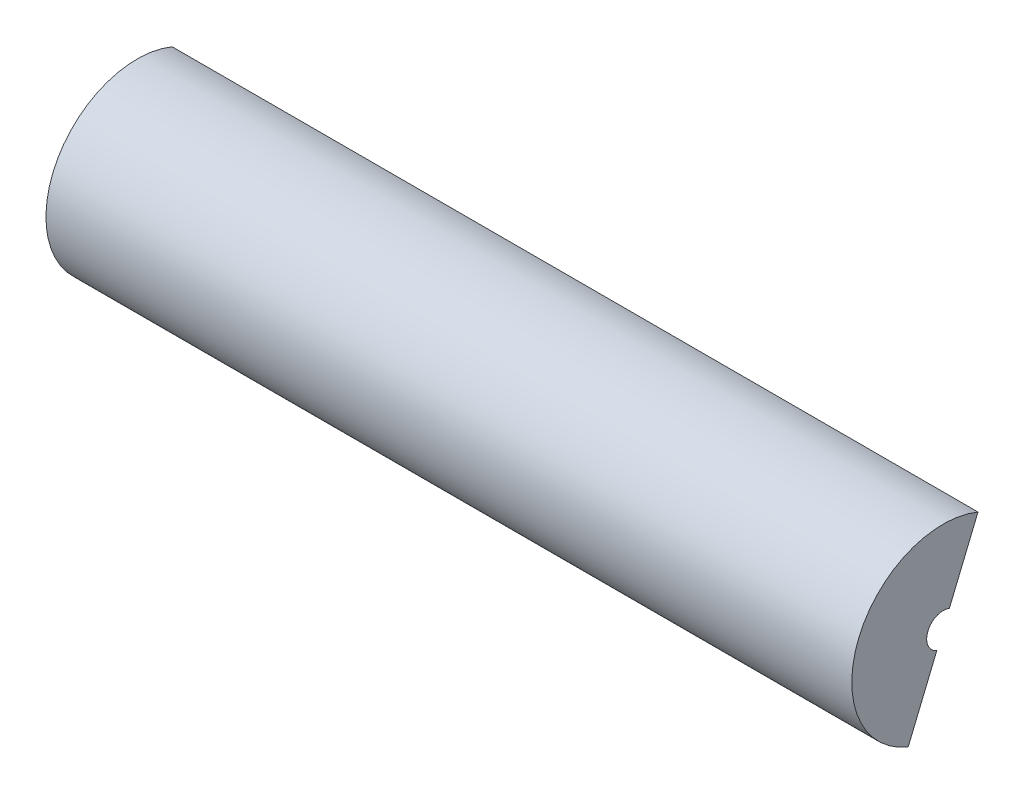
ISO-10303-21;
HEADER;
FILE_DESCRIPTION(('STEP AP214'),'2;1');
FILE_NAME('part.step','',(''),(''),'','','');
FILE_SCHEMA(('AUTOMOTIVE_DESIGN { 1 0 10303 214 1 1 1 1 }'));
ENDSEC;
DATA;
#1=APPLICATION_CONTEXT('core data for automotive mechanical design processes');
#2=APPLICATION_PROTOCOL_DEFINITION('international standard','automotive_design',2000,#1);
#3=PRODUCT_CONTEXT('',#1,'mechanical');
#4=PRODUCT('Part','Part','',(#3));
#5=PRODUCT_RELATED_PRODUCT_CATEGORY('part','',(#4));
#6=PRODUCT_DEFINITION_FORMATION('','',#4);
#7=PRODUCT_DEFINITION_CONTEXT('part definition',#1,'design');
#8=PRODUCT_DEFINITION('design','',#6,#7);
#9=PRODUCT_DEFINITION_SHAPE('','',#8);
#10=(LENGTH_UNIT() NAMED_UNIT(*) SI_UNIT(.MILLI.,.METRE.));
#11=(NAMED_UNIT(*) PLANE_ANGLE_UNIT() SI_UNIT($,.RADIAN.));
#12=(NAMED_UNIT(*) SI_UNIT($,.STERADIAN.) SOLID_ANGLE_UNIT());
#13=UNCERTAINTY_MEASURE_WITH_UNIT(LENGTH_MEASURE(1.E-05),#10,'distance_accuracy_value','');
#14=(GEOMETRIC_REPRESENTATION_CONTEXT(3) GLOBAL_UNCERTAINTY_ASSIGNED_CONTEXT((#13)) GLOBAL_UNIT_ASSIGNED_CONTEXT((#10,
#11,#12)) REPRESENTATION_CONTEXT('',''));
#15=CARTESIAN_POINT('',(0.,0.,0.));
#16=DIRECTION('',(0.,0.,1.));
#17=DIRECTION('',(1.,0.,0.));
#18=AXIS2_PLACEMENT_3D('',#15,#16,#17);
#19=CARTESIAN_POINT('',(0.,12.7,0.));
#20=DIRECTION('',(1.,0.,0.));
#21=DIRECTION('',(0.,0.,-1.));
#22=AXIS2_PLACEMENT_3D('',#19,#20,#21);
#23=PLANE('',#22);
#24=CARTESIAN_POINT('',(0.,0.,0.));
#25=DIRECTION('',(-1.,0.,0.));
#26=DIRECTION('',(0.,0.,1.));
#27=AXIS2_PLACEMENT_3D('',#24,#25,#26);
#28=CIRCLE('',#27,31.);
#29=CARTESIAN_POINT('',(0.,-28.6402655078499,11.8631864033178));
#30=VERTEX_POINT('',#29);
#31=CARTESIAN_POINT('',(0.,28.6402655078499,-11.8631864033178));
#32=VERTEX_POINT('',#31);
#33=EDGE_CURVE('E119',#30,#32,#28,.T.);
#34=ORIENTED_EDGE('',*,*,#33,.T.);
#35=DIRECTION('',(0.,-0.923879532511287,0.382683432365091));
#36=VECTOR('',#35,1.);
#37=CARTESIAN_POINT('',(0.,28.6402655078499,-11.8631864033178));
#38=LINE('',#37,#36);
#39=CARTESIAN_POINT('',(0.,11.7332700628933,-4.86007959103665));
#40=VERTEX_POINT('',#39);
#41=EDGE_CURVE('E101',#32,#40,#38,.T.);
#42=ORIENTED_EDGE('',*,*,#41,.T.);
#43=CARTESIAN_POINT('',(0.,0.,0.));
#44=DIRECTION('',(-1.,0.,0.));
#45=DIRECTION('',(0.,0.,1.));
#46=AXIS2_PLACEMENT_3D('',#43,#44,#45);
#47=CIRCLE('',#46,12.7);
#48=CARTESIAN_POINT('',(0.,-11.7332700628933,4.86007959103665));
#49=VERTEX_POINT('',#48);
#50=EDGE_CURVE('E11',#49,#40,#47,.T.);
#51=ORIENTED_EDGE('',*,*,#50,.F.);
#52=EDGE_CURVE('E113',#49,#30,#38,.T.);
#53=ORIENTED_EDGE('',*,*,#52,.T.);
#54=EDGE_LOOP('',(#34,#42,#51,#53));
#55=FACE_BOUND('',#54,.T.);
#56=ADVANCED_FACE('F39',(#55),#23,.F.);
#57=CARTESIAN_POINT('',(0.,0.,0.));
#58=DIRECTION('',(-1.,0.,0.));
#59=DIRECTION('',(0.,0.,1.));
#60=AXIS2_PLACEMENT_3D('',#57,#58,#59);
#61=CYLINDRICAL_SURFACE('',#60,12.7);
#62=ORIENTED_EDGE('',*,*,#50,.T.);
#63=DIRECTION('',(-1.,0.,0.));
#64=VECTOR('',#63,1.);
#65=CARTESIAN_POINT('',(0.,11.7332700628933,-4.86007959103665));
#66=LINE('',#65,#64);
#67=CARTESIAN_POINT('',(196.85,11.7332700628933,-4.86007959103665));
#68=VERTEX_POINT('',#67);
#69=EDGE_CURVE('E107',#40,#68,#66,.F.);
#70=ORIENTED_EDGE('',*,*,#69,.T.);
#71=CARTESIAN_POINT('',(196.85,0.,0.));
#72=DIRECTION('',(-1.,0.,0.));
#73=DIRECTION('',(0.,0.,1.));
#74=AXIS2_PLACEMENT_3D('',#71,#72,#73);
#75=CIRCLE('',#74,12.7);
#76=CARTESIAN_POINT('',(196.85,-11.7332700628933,4.86007959103665));
#77=VERTEX_POINT('',#76);
#78=EDGE_CURVE('E47',#77,#68,#75,.T.);
#79=ORIENTED_EDGE('',*,*,#78,.F.);
#80=DIRECTION('',(-1.,0.,0.));
#81=VECTOR('',#80,1.);
#82=CARTESIAN_POINT('',(0.,-11.7332700628933,4.86007959103665));
#83=LINE('',#82,#81);
#84=EDGE_CURVE('E61',#77,#49,#83,.T.);
#85=ORIENTED_EDGE('',*,*,#84,.T.);
#86=EDGE_LOOP('',(#62,#70,#79,#85));
#87=FACE_BOUND('',#86,.T.);
#88=ADVANCED_FACE('F163',(#87),#61,.F.);
#89=CARTESIAN_POINT('',(196.85,12.7,0.));
#90=DIRECTION('',(-1.,0.,0.));
#91=DIRECTION('',(0.,0.,1.));
#92=AXIS2_PLACEMENT_3D('',#89,#90,#91);
#93=PLANE('',#92);
#94=CARTESIAN_POINT('',(196.85,0.,0.));
#95=DIRECTION('',(-1.,0.,0.));
#96=DIRECTION('',(0.,0.,1.));
#97=AXIS2_PLACEMENT_3D('',#94,#95,#96);
#98=CIRCLE('',#97,26.162);
#99=CARTESIAN_POINT('',(196.85,-24.1705363295603,10.0117639575355));
#100=VERTEX_POINT('',#99);
#101=CARTESIAN_POINT('',(196.85,24.1705363295603,-10.0117639575355));
#102=VERTEX_POINT('',#101);
#103=EDGE_CURVE('E150',#100,#102,#98,.T.);
#104=ORIENTED_EDGE('',*,*,#103,.F.);
#105=DIRECTION('',(0.,0.923879532511287,-0.382683432365091));
#106=VECTOR('',#105,1.);
#107=CARTESIAN_POINT('',(196.85,10.8401280605346,-4.49012806053458));
#108=LINE('',#107,#106);
#109=EDGE_CURVE('E161',#100,#77,#108,.T.);
#110=ORIENTED_EDGE('',*,*,#109,.T.);
#111=ORIENTED_EDGE('',*,*,#78,.T.);
#112=EDGE_CURVE('E160',#68,#102,#108,.T.);
#113=ORIENTED_EDGE('',*,*,#112,.T.);
#114=EDGE_LOOP('',(#104,#110,#111,#113));
#115=FACE_BOUND('',#114,.T.);
#116=ADVANCED_FACE('F159',(#115),#93,.F.);
#117=CARTESIAN_POINT('',(0.,0.,0.));
#118=DIRECTION('',(-1.,0.,0.));
#119=DIRECTION('',(0.,0.,1.));
#120=AXIS2_PLACEMENT_3D('',#117,#118,#119);
#121=CYLINDRICAL_SURFACE('',#120,26.162);
#122=ORIENTED_EDGE('',*,*,#103,.T.);
#123=DIRECTION('',(-1.,0.,0.));
#124=VECTOR('',#123,1.);
#125=CARTESIAN_POINT('',(0.,24.1705363295603,-10.0117639575355));
#126=LINE('',#125,#124);
#127=CARTESIAN_POINT('',(241.3,24.1705363295603,-10.0117639575355));
#128=VERTEX_POINT('',#127);
#129=EDGE_CURVE('E232',#102,#128,#126,.F.);
#130=ORIENTED_EDGE('',*,*,#129,.T.);
#131=CARTESIAN_POINT('',(241.3,0.,0.));
#132=DIRECTION('',(-1.,0.,0.));
#133=DIRECTION('',(0.,0.,1.));
#134=AXIS2_PLACEMENT_3D('',#131,#132,#133);
#135=CIRCLE('',#134,26.162);
#136=CARTESIAN_POINT('',(241.3,-24.1705363295603,10.0117639575355));
#137=VERTEX_POINT('',#136);
#138=EDGE_CURVE('E146',#137,#128,#135,.T.);
#139=ORIENTED_EDGE('',*,*,#138,.F.);
#140=DIRECTION('',(-1.,0.,0.));
#141=VECTOR('',#140,1.);
#142=CARTESIAN_POINT('',(0.,-24.1705363295603,10.0117639575355));
#143=LINE('',#142,#141);
#144=EDGE_CURVE('E228',#137,#100,#143,.T.);
#145=ORIENTED_EDGE('',*,*,#144,.T.);
#146=EDGE_LOOP('',(#122,#130,#139,#145));
#147=FACE_BOUND('',#146,.T.);
#148=ADVANCED_FACE('F239',(#147),#121,.F.);
#149=CARTESIAN_POINT('',(241.3,26.162,0.));
#150=DIRECTION('',(1.,0.,0.));
#151=DIRECTION('',(0.,0.,-1.));
#152=AXIS2_PLACEMENT_3D('',#149,#150,#151);
#153=PLANE('',#152);
#154=CARTESIAN_POINT('',(241.3,6.477,0.));
#155=DIRECTION('',(-1.,0.,0.));
#156=DIRECTION('',(0.,0.,1.));
#157=AXIS2_PLACEMENT_3D('',#154,#155,#156);
#158=CIRCLE('',#157,0.80645);
#159=CARTESIAN_POINT('',(241.3,6.477,0.80645));
#160=VERTEX_POINT('',#159);
#161=EDGE_CURVE('E133',#160,#160,#158,.T.);
#162=ORIENTED_EDGE('',*,*,#161,.F.);
#163=EDGE_LOOP('',(#162));
#164=FACE_BOUND('',#163,.T.);
#165=CARTESIAN_POINT('',(241.3,4.57993062174527,4.57993062174527));
#166=DIRECTION('',(-1.,0.,0.));
#167=DIRECTION('',(0.,0.,1.));
#168=AXIS2_PLACEMENT_3D('',#165,#166,#167);
#169=CIRCLE('',#168,0.806450000000011);
#170=CARTESIAN_POINT('',(241.3,4.57993062174527,5.38638062174528));
#171=VERTEX_POINT('',#170);
#172=EDGE_CURVE('E180',#171,#171,#169,.T.);
#173=ORIENTED_EDGE('',*,*,#172,.F.);
#174=EDGE_LOOP('',(#173));
#175=FACE_BOUND('',#174,.T.);
#176=CARTESIAN_POINT('',(241.3,0.,6.477));
#177=DIRECTION('',(-1.,0.,0.));
#178=DIRECTION('',(0.,0.,1.));
#179=AXIS2_PLACEMENT_3D('',#176,#177,#178);
#180=CIRCLE('',#179,0.806450000000022);
#181=CARTESIAN_POINT('',(241.3,0.,7.28345000000002));
#182=VERTEX_POINT('',#181);
#183=EDGE_CURVE('E188',#182,#182,#180,.T.);
#184=ORIENTED_EDGE('',*,*,#183,.F.);
#185=EDGE_LOOP('',(#184));
#186=FACE_BOUND('',#185,.T.);
#187=CARTESIAN_POINT('',(241.3,-4.57993062174527,4.57993062174527));
#188=DIRECTION('',(-1.,0.,0.));
#189=DIRECTION('',(0.,0.,1.));
#190=AXIS2_PLACEMENT_3D('',#187,#188,#189);
#191=CIRCLE('',#190,0.806450000000034);
#192=CARTESIAN_POINT('',(241.3,-4.57993062174527,5.3863806217453));
#193=VERTEX_POINT('',#192);
#194=EDGE_CURVE('E136',#193,#193,#191,.T.);
#195=ORIENTED_EDGE('',*,*,#194,.F.);
#196=EDGE_LOOP('',(#195));
#197=FACE_BOUND('',#196,.T.);
#198=ORIENTED_EDGE('',*,*,#138,.T.);
#199=DIRECTION('',(0.,-0.923879532511287,0.382683432365091));
#200=VECTOR('',#199,1.);
#201=CARTESIAN_POINT('',(241.3,22.3306638047012,-9.24966380470124));
#202=LINE('',#201,#200);
#203=EDGE_CURVE('E224',#128,#137,#202,.T.);
#204=ORIENTED_EDGE('',*,*,#203,.T.);
#205=EDGE_LOOP('',(#198,#204));
#206=FACE_BOUND('',#205,.T.);
#207=ADVANCED_FACE('F201',(#164,#175,#186,#197,#206),#153,.F.);
#208=CARTESIAN_POINT('',(259.36,10.7696,0.));
#209=DIRECTION('',(-1.,0.,0.));
#210=DIRECTION('',(0.,0.,1.));
#211=AXIS2_PLACEMENT_3D('',#208,#209,#210);
#212=PLANE('',#211);
#213=CARTESIAN_POINT('',(259.36,6.477,0.));
#214=DIRECTION('',(-1.,0.,0.));
#215=DIRECTION('',(0.,0.,1.));
#216=AXIS2_PLACEMENT_3D('',#213,#214,#215);
#217=CIRCLE('',#216,0.80645);
#218=CARTESIAN_POINT('',(259.36,6.477,0.80645));
#219=VERTEX_POINT('',#218);
#220=EDGE_CURVE('E126',#219,#219,#217,.F.);
#221=ORIENTED_EDGE('',*,*,#220,.F.);
#222=EDGE_LOOP('',(#221));
#223=FACE_BOUND('',#222,.T.);
#224=CARTESIAN_POINT('',(259.36,4.57993062174527,4.57993062174527));
#225=DIRECTION('',(-1.,0.,0.));
#226=DIRECTION('',(0.,0.,1.));
#227=AXIS2_PLACEMENT_3D('',#224,#225,#226);
#228=CIRCLE('',#227,0.806450000000011);
#229=CARTESIAN_POINT('',(259.36,4.57993062174527,5.38638062174528));
#230=VERTEX_POINT('',#229);
#231=EDGE_CURVE('E176',#230,#230,#228,.F.);
#232=ORIENTED_EDGE('',*,*,#231,.F.);
#233=EDGE_LOOP('',(#232));
#234=FACE_BOUND('',#233,.T.);
#235=CARTESIAN_POINT('',(259.36,0.,6.477));
#236=DIRECTION('',(-1.,0.,0.));
#237=DIRECTION('',(0.,0.,1.));
#238=AXIS2_PLACEMENT_3D('',#235,#236,#237);
#239=CIRCLE('',#238,0.806450000000022);
#240=CARTESIAN_POINT('',(259.36,0.,7.28345000000002));
#241=VERTEX_POINT('',#240);
#242=EDGE_CURVE('E184',#241,#241,#239,.F.);
#243=ORIENTED_EDGE('',*,*,#242,.F.);
#244=EDGE_LOOP('',(#243));
#245=FACE_BOUND('',#244,.T.);
#246=CARTESIAN_POINT('',(259.36,-4.57993062174527,4.57993062174527));
#247=DIRECTION('',(-1.,0.,0.));
#248=DIRECTION('',(0.,0.,1.));
#249=AXIS2_PLACEMENT_3D('',#246,#247,#248);
#250=CIRCLE('',#249,0.806450000000034);
#251=CARTESIAN_POINT('',(259.36,-4.57993062174527,5.3863806217453));
#252=VERTEX_POINT('',#251);
#253=EDGE_CURVE('E169',#252,#252,#250,.F.);
#254=ORIENTED_EDGE('',*,*,#253,.F.);
#255=EDGE_LOOP('',(#254));
#256=FACE_BOUND('',#255,.T.);
#257=CARTESIAN_POINT('',(259.36,0.,0.));
#258=DIRECTION('',(-1.,0.,0.));
#259=DIRECTION('',(0.,0.,1.));
#260=AXIS2_PLACEMENT_3D('',#257,#258,#259);
#261=CIRCLE('',#260,10.7696);
#262=CARTESIAN_POINT('',(259.36,-9.94981301333355,4.12134749319908));
#263=VERTEX_POINT('',#262);
#264=CARTESIAN_POINT('',(259.36,9.94981301333355,-4.12134749319908));
#265=VERTEX_POINT('',#264);
#266=EDGE_CURVE('E142',#263,#265,#261,.T.);
#267=ORIENTED_EDGE('',*,*,#266,.F.);
#268=DIRECTION('',(0.,0.923879532511287,-0.382683432365091));
#269=VECTOR('',#268,1.);
#270=CARTESIAN_POINT('',(259.36,9.19242859533332,-3.80762859533333));
#271=LINE('',#270,#269);
#272=EDGE_CURVE('E206',#263,#265,#271,.T.);
#273=ORIENTED_EDGE('',*,*,#272,.T.);
#274=EDGE_LOOP('',(#267,#273));
#275=FACE_BOUND('',#274,.T.);
#276=ADVANCED_FACE('F197',(#223,#234,#245,#256,#275),#212,.F.);
#277=CARTESIAN_POINT('',(259.36,0.,0.));
#278=DIRECTION('',(-1.,0.,0.));
#279=DIRECTION('',(0.,0.,1.));
#280=AXIS2_PLACEMENT_3D('',#277,#278,#279);
#281=CONICAL_SURFACE('',#280,10.7696,0.349066185653854);
#282=ORIENTED_EDGE('',*,*,#266,.T.);
#283=DIRECTION('',(-0.939692506121897,0.315985701181046,-0.130885562945162));
#284=VECTOR('',#283,1.);
#285=CARTESIAN_POINT('',(288.94920195122,0.,0.));
#286=LINE('',#285,#284);
#287=CARTESIAN_POINT('',(273.6661,5.13917228754728,-2.12871486087405));
#288=VERTEX_POINT('',#287);
#289=EDGE_CURVE('E211',#265,#288,#286,.F.);
#290=ORIENTED_EDGE('',*,*,#289,.T.);
#291=CARTESIAN_POINT('',(273.6661,0.,0.));
#292=DIRECTION('',(-1.,0.,0.));
#293=DIRECTION('',(0.,0.,1.));
#294=AXIS2_PLACEMENT_3D('',#291,#292,#293);
#295=CIRCLE('',#294,5.5626);
#296=CARTESIAN_POINT('',(273.6661,-5.13917228754729,2.12871486087405));
#297=VERTEX_POINT('',#296);
#298=EDGE_CURVE('E130',#297,#288,#295,.T.);
#299=ORIENTED_EDGE('',*,*,#298,.F.);
#300=DIRECTION('',(0.939692506121897,0.315985701181046,-0.130885562945162));
#301=VECTOR('',#300,1.);
#302=CARTESIAN_POINT('',(288.94920195122,0.,0.));
#303=LINE('',#302,#301);
#304=EDGE_CURVE('E212',#297,#263,#303,.F.);
#305=ORIENTED_EDGE('',*,*,#304,.T.);
#306=EDGE_LOOP('',(#282,#290,#299,#305));
#307=FACE_BOUND('',#306,.T.);
#308=ADVANCED_FACE('F200',(#307),#281,.F.);
#309=CARTESIAN_POINT('',(273.6661,5.5626,0.));
#310=DIRECTION('',(-1.,0.,0.));
#311=DIRECTION('',(0.,0.,1.));
#312=AXIS2_PLACEMENT_3D('',#309,#310,#311);
#313=PLANE('',#312);
#314=CARTESIAN_POINT('',(273.6661,0.,0.));
#315=DIRECTION('',(-1.,0.,0.));
#316=DIRECTION('',(0.,0.,1.));
#317=AXIS2_PLACEMENT_3D('',#314,#315,#316);
#318=CIRCLE('',#317,31.);
#319=CARTESIAN_POINT('',(273.6661,-28.6402655078499,11.8631864033178));
#320=VERTEX_POINT('',#319);
#321=CARTESIAN_POINT('',(273.6661,28.6402655078499,-11.8631864033178));
#322=VERTEX_POINT('',#321);
#323=EDGE_CURVE('E121',#320,#322,#318,.T.);
#324=ORIENTED_EDGE('',*,*,#323,.F.);
#325=DIRECTION('',(0.,0.923879532511287,-0.382683432365091));
#326=VECTOR('',#325,1.);
#327=CARTESIAN_POINT('',(273.6661,28.6402655078499,-11.8631864033178));
#328=LINE('',#327,#326);
#329=EDGE_CURVE('E54',#320,#297,#328,.T.);
#330=ORIENTED_EDGE('',*,*,#329,.T.);
#331=ORIENTED_EDGE('',*,*,#298,.T.);
#332=EDGE_CURVE('E218',#288,#322,#328,.T.);
#333=ORIENTED_EDGE('',*,*,#332,.T.);
#334=EDGE_LOOP('',(#324,#330,#331,#333));
#335=FACE_BOUND('',#334,.T.);
#336=ADVANCED_FACE('F283',(#335),#313,.F.);
#337=CARTESIAN_POINT('',(0.,0.,0.));
#338=DIRECTION('',(-1.,0.,0.));
#339=DIRECTION('',(0.,0.,1.));
#340=AXIS2_PLACEMENT_3D('',#337,#338,#339);
#341=CYLINDRICAL_SURFACE('',#340,31.);
#342=ORIENTED_EDGE('',*,*,#323,.T.);
#343=DIRECTION('',(-1.,0.,0.));
#344=VECTOR('',#343,1.);
#345=CARTESIAN_POINT('',(273.6661,28.6402655078499,-11.8631864033178));
#346=LINE('',#345,#344);
#347=EDGE_CURVE('E104',#322,#32,#346,.T.);
#348=ORIENTED_EDGE('',*,*,#347,.T.);
#349=ORIENTED_EDGE('',*,*,#33,.F.);
#350=DIRECTION('',(1.,0.,0.));
#351=VECTOR('',#350,1.);
#352=CARTESIAN_POINT('',(273.6661,-28.6402655078499,11.8631864033178));
#353=LINE('',#352,#351);
#354=EDGE_CURVE('E112',#30,#320,#353,.T.);
#355=ORIENTED_EDGE('',*,*,#354,.T.);
#356=EDGE_LOOP('',(#342,#348,#349,#355));
#357=FACE_BOUND('',#356,.T.);
#358=ADVANCED_FACE('F118',(#357),#341,.T.);
#359=CARTESIAN_POINT('',(273.6671,-4.57993062174527,4.57993062174527));
#360=DIRECTION('',(-1.,0.,0.));
#361=DIRECTION('',(0.,0.,1.));
#362=AXIS2_PLACEMENT_3D('',#359,#360,#361);
#363=CYLINDRICAL_SURFACE('',#362,0.806450000000034);
#364=ORIENTED_EDGE('',*,*,#194,.T.);
#365=EDGE_LOOP('',(#364));
#366=FACE_BOUND('',#365,.T.);
#367=ORIENTED_EDGE('',*,*,#253,.T.);
#368=EDGE_LOOP('',(#367));
#369=FACE_BOUND('',#368,.T.);
#370=ADVANCED_FACE('F195',(#366,#369),#363,.F.);
#371=CARTESIAN_POINT('',(273.6671,0.,6.477));
#372=DIRECTION('',(-1.,0.,0.));
#373=DIRECTION('',(0.,0.,1.));
#374=AXIS2_PLACEMENT_3D('',#371,#372,#373);
#375=CYLINDRICAL_SURFACE('',#374,0.806450000000022);
#376=ORIENTED_EDGE('',*,*,#183,.T.);
#377=EDGE_LOOP('',(#376));
#378=FACE_BOUND('',#377,.T.);
#379=ORIENTED_EDGE('',*,*,#242,.T.);
#380=EDGE_LOOP('',(#379));
#381=FACE_BOUND('',#380,.T.);
#382=ADVANCED_FACE('F327',(#378,#381),#375,.F.);
#383=CARTESIAN_POINT('',(273.6671,4.57993062174527,4.57993062174527));
#384=DIRECTION('',(-1.,0.,0.));
#385=DIRECTION('',(0.,0.,1.));
#386=AXIS2_PLACEMENT_3D('',#383,#384,#385);
#387=CYLINDRICAL_SURFACE('',#386,0.806450000000011);
#388=ORIENTED_EDGE('',*,*,#172,.T.);
#389=EDGE_LOOP('',(#388));
#390=FACE_BOUND('',#389,.T.);
#391=ORIENTED_EDGE('',*,*,#231,.T.);
#392=EDGE_LOOP('',(#391));
#393=FACE_BOUND('',#392,.T.);
#394=ADVANCED_FACE('F320',(#390,#393),#387,.F.);
#395=CARTESIAN_POINT('',(273.6671,6.477,0.));
#396=DIRECTION('',(-1.,0.,0.));
#397=DIRECTION('',(0.,0.,1.));
#398=AXIS2_PLACEMENT_3D('',#395,#396,#397);
#399=CYLINDRICAL_SURFACE('',#398,0.80645);
#400=ORIENTED_EDGE('',*,*,#161,.T.);
#401=EDGE_LOOP('',(#400));
#402=FACE_BOUND('',#401,.T.);
#403=ORIENTED_EDGE('',*,*,#220,.T.);
#404=EDGE_LOOP('',(#403));
#405=FACE_BOUND('',#404,.T.);
#406=ADVANCED_FACE('F310',(#402,#405),#399,.F.);
#407=CARTESIAN_POINT('',(0.,0.,0.));
#408=DIRECTION('',(0.,0.382683432365091,0.923879532511287));
#409=DIRECTION('',(0.,-0.923879532511287,0.382683432365091));
#410=AXIS2_PLACEMENT_3D('',#407,#408,#409);
#411=PLANE('',#410);
#412=ORIENTED_EDGE('',*,*,#41,.F.);
#413=ORIENTED_EDGE('',*,*,#347,.F.);
#414=ORIENTED_EDGE('',*,*,#332,.F.);
#415=ORIENTED_EDGE('',*,*,#289,.F.);
#416=ORIENTED_EDGE('',*,*,#272,.F.);
#417=ORIENTED_EDGE('',*,*,#304,.F.);
#418=ORIENTED_EDGE('',*,*,#329,.F.);
#419=ORIENTED_EDGE('',*,*,#354,.F.);
#420=ORIENTED_EDGE('',*,*,#52,.F.);
#421=ORIENTED_EDGE('',*,*,#84,.F.);
#422=ORIENTED_EDGE('',*,*,#109,.F.);
#423=ORIENTED_EDGE('',*,*,#144,.F.);
#424=ORIENTED_EDGE('',*,*,#203,.F.);
#425=ORIENTED_EDGE('',*,*,#129,.F.);
#426=ORIENTED_EDGE('',*,*,#112,.F.);
#427=ORIENTED_EDGE('',*,*,#69,.F.);
#428=EDGE_LOOP('',(#412,#413,#414,#415,#416,#417,#418,#419,#420,#421,#422,#423,#424,#425,#426,#427));
#429=FACE_BOUND('',#428,.T.);
#430=ADVANCED_FACE('F103',(#429),#411,.F.);
#431=CLOSED_SHELL('',(#56,#88,#116,#148,#207,#276,#308,#336,#358,#370,#382,#394,#406,#430));
#432=MANIFOLD_SOLID_BREP('B2',#431);
#433=ADVANCED_BREP_SHAPE_REPRESENTATION('',(#18,#432),#14);
#434=SHAPE_DEFINITION_REPRESENTATION(#9,#433);
ENDSEC;
END-ISO-10303-21;
